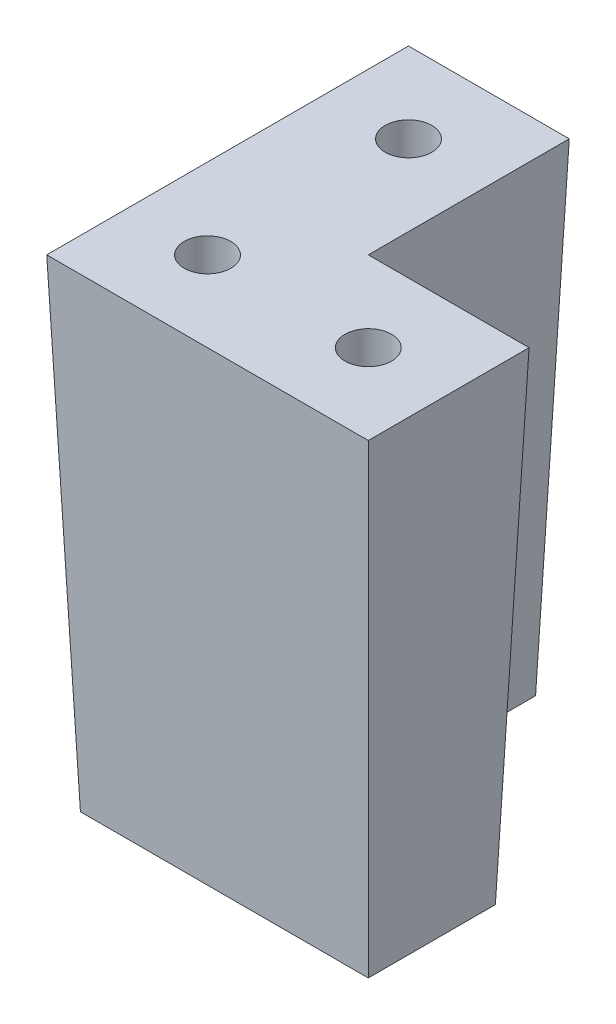
ISO-10303-21;
HEADER;
FILE_DESCRIPTION(('STEP AP214'),'2;1');
FILE_NAME('part.step','',(''),(''),'','','');
FILE_SCHEMA(('AUTOMOTIVE_DESIGN { 1 0 10303 214 1 1 1 1 }'));
ENDSEC;
DATA;
#1=APPLICATION_CONTEXT('core data for automotive mechanical design processes');
#2=APPLICATION_PROTOCOL_DEFINITION('international standard','automotive_design',2000,#1);
#3=PRODUCT_CONTEXT('',#1,'mechanical');
#4=PRODUCT('Part','Part','',(#3));
#5=PRODUCT_RELATED_PRODUCT_CATEGORY('part','',(#4));
#6=PRODUCT_DEFINITION_FORMATION('','',#4);
#7=PRODUCT_DEFINITION_CONTEXT('part definition',#1,'design');
#8=PRODUCT_DEFINITION('design','',#6,#7);
#9=PRODUCT_DEFINITION_SHAPE('','',#8);
#10=(LENGTH_UNIT() NAMED_UNIT(*) SI_UNIT(.MILLI.,.METRE.));
#11=(NAMED_UNIT(*) PLANE_ANGLE_UNIT() SI_UNIT($,.RADIAN.));
#12=(NAMED_UNIT(*) SI_UNIT($,.STERADIAN.) SOLID_ANGLE_UNIT());
#13=UNCERTAINTY_MEASURE_WITH_UNIT(LENGTH_MEASURE(1.E-05),#10,'distance_accuracy_value','');
#14=(GEOMETRIC_REPRESENTATION_CONTEXT(3) GLOBAL_UNCERTAINTY_ASSIGNED_CONTEXT((#13)) GLOBAL_UNIT_ASSIGNED_CONTEXT((#10,
#11,#12)) REPRESENTATION_CONTEXT('',''));
#15=CARTESIAN_POINT('',(0.,0.,0.));
#16=DIRECTION('',(0.,0.,1.));
#17=DIRECTION('',(1.,0.,0.));
#18=AXIS2_PLACEMENT_3D('',#15,#16,#17);
#19=CARTESIAN_POINT('',(0.,0.,0.));
#20=DIRECTION('',(-0.999390827019096,-0.034899496702501,0.));
#21=DIRECTION('',(0.034899496702501,-0.999390827019096,0.));
#22=AXIS2_PLACEMENT_3D('',#19,#20,#21);
#23=PLANE('',#22);
#24=DIRECTION('',(0.,0.,1.));
#25=VECTOR('',#24,1.);
#26=CARTESIAN_POINT('',(0.,0.,0.));
#27=LINE('',#26,#25);
#28=CARTESIAN_POINT('',(0.,0.,-45.));
#29=VERTEX_POINT('',#28);
#30=CARTESIAN_POINT('',(0.,0.,0.));
#31=VERTEX_POINT('',#30);
#32=EDGE_CURVE('E121',#29,#31,#27,.T.);
#33=ORIENTED_EDGE('',*,*,#32,.F.);
#34=DIRECTION('',(-0.0348782627423747,0.998782765958718,-0.0348782627423747));
#35=VECTOR('',#34,1.);
#36=CARTESIAN_POINT('',(0.,0.,-45.));
#37=LINE('',#36,#35);
#38=CARTESIAN_POINT('',(2.09524616950487,-60.,-42.9047538304951));
#39=VERTEX_POINT('',#38);
#40=EDGE_CURVE('E11',#39,#29,#37,.T.);
#41=ORIENTED_EDGE('',*,*,#40,.F.);
#42=DIRECTION('',(0.,0.,1.));
#43=VECTOR('',#42,1.);
#44=CARTESIAN_POINT('',(2.09524616950487,-60.,0.));
#45=LINE('',#44,#43);
#46=CARTESIAN_POINT('',(2.09524616950487,-60.,-2.09524616950487));
#47=VERTEX_POINT('',#46);
#48=EDGE_CURVE('E123',#39,#47,#45,.T.);
#49=ORIENTED_EDGE('',*,*,#48,.T.);
#50=DIRECTION('',(-0.0348782627423747,0.998782765958718,0.0348782627423747));
#51=VECTOR('',#50,1.);
#52=CARTESIAN_POINT('',(0.,0.,0.));
#53=LINE('',#52,#51);
#54=EDGE_CURVE('E94',#47,#31,#53,.T.);
#55=ORIENTED_EDGE('',*,*,#54,.T.);
#56=EDGE_LOOP('',(#33,#41,#49,#55));
#57=FACE_BOUND('',#56,.T.);
#58=ADVANCED_FACE('F43',(#57),#23,.T.);
#59=CARTESIAN_POINT('',(0.,0.,-45.));
#60=DIRECTION('',(0.,-0.034899496702501,-0.999390827019096));
#61=DIRECTION('',(0.,0.999390827019096,-0.034899496702501));
#62=AXIS2_PLACEMENT_3D('',#59,#60,#61);
#63=PLANE('',#62);
#64=DIRECTION('',(-1.,0.,0.));
#65=VECTOR('',#64,1.);
#66=CARTESIAN_POINT('',(0.,0.,-45.));
#67=LINE('',#66,#65);
#68=CARTESIAN_POINT('',(20.,0.,-45.));
#69=VERTEX_POINT('',#68);
#70=EDGE_CURVE('E136',#69,#29,#67,.T.);
#71=ORIENTED_EDGE('',*,*,#70,.F.);
#72=DIRECTION('',(0.0348782627423747,0.998782765958718,-0.0348782627423747));
#73=VECTOR('',#72,1.);
#74=CARTESIAN_POINT('',(20.,0.,-45.));
#75=LINE('',#74,#73);
#76=CARTESIAN_POINT('',(17.9047538304951,-60.,-42.9047538304951));
#77=VERTEX_POINT('',#76);
#78=EDGE_CURVE('E54',#77,#69,#75,.T.);
#79=ORIENTED_EDGE('',*,*,#78,.F.);
#80=DIRECTION('',(-1.,0.,0.));
#81=VECTOR('',#80,1.);
#82=CARTESIAN_POINT('',(0.,-60.,-42.9047538304951));
#83=LINE('',#82,#81);
#84=EDGE_CURVE('E125',#77,#39,#83,.T.);
#85=ORIENTED_EDGE('',*,*,#84,.T.);
#86=ORIENTED_EDGE('',*,*,#40,.T.);
#87=EDGE_LOOP('',(#71,#79,#85,#86));
#88=FACE_BOUND('',#87,.T.);
#89=ADVANCED_FACE('F45',(#88),#63,.T.);
#90=CARTESIAN_POINT('',(20.,0.,-45.));
#91=DIRECTION('',(0.999390827019096,-0.034899496702501,0.));
#92=DIRECTION('',(0.034899496702501,0.999390827019096,0.));
#93=AXIS2_PLACEMENT_3D('',#90,#91,#92);
#94=PLANE('',#93);
#95=DIRECTION('',(0.,0.,-1.));
#96=VECTOR('',#95,1.);
#97=CARTESIAN_POINT('',(20.,0.,-45.));
#98=LINE('',#97,#96);
#99=CARTESIAN_POINT('',(20.,0.,-20.));
#100=VERTEX_POINT('',#99);
#101=EDGE_CURVE('E152',#100,#69,#98,.T.);
#102=ORIENTED_EDGE('',*,*,#101,.F.);
#103=DIRECTION('',(0.0348782627423747,0.998782765958718,-0.0348782627423747));
#104=VECTOR('',#103,1.);
#105=CARTESIAN_POINT('',(20.0304123302982,0.870895193341597,-20.0304123302982));
#106=LINE('',#105,#104);
#107=CARTESIAN_POINT('',(17.9047538304951,-60.,-17.9047538304951));
#108=VERTEX_POINT('',#107);
#109=EDGE_CURVE('E162',#108,#100,#106,.T.);
#110=ORIENTED_EDGE('',*,*,#109,.F.);
#111=DIRECTION('',(0.,0.,-1.));
#112=VECTOR('',#111,1.);
#113=CARTESIAN_POINT('',(17.9047538304951,-60.,-45.));
#114=LINE('',#113,#112);
#115=EDGE_CURVE('E171',#108,#77,#114,.T.);
#116=ORIENTED_EDGE('',*,*,#115,.T.);
#117=ORIENTED_EDGE('',*,*,#78,.T.);
#118=EDGE_LOOP('',(#102,#110,#116,#117));
#119=FACE_BOUND('',#118,.T.);
#120=ADVANCED_FACE('F189',(#119),#94,.T.);
#121=CARTESIAN_POINT('',(40.,0.,-20.));
#122=DIRECTION('',(0.,-0.034899496702501,-0.999390827019096));
#123=DIRECTION('',(0.,0.999390827019096,-0.034899496702501));
#124=AXIS2_PLACEMENT_3D('',#121,#122,#123);
#125=PLANE('',#124);
#126=DIRECTION('',(-1.,0.,0.));
#127=VECTOR('',#126,1.);
#128=CARTESIAN_POINT('',(40.,0.,-20.));
#129=LINE('',#128,#127);
#130=CARTESIAN_POINT('',(40.,0.,-20.));
#131=VERTEX_POINT('',#130);
#132=EDGE_CURVE('E148',#131,#100,#129,.T.);
#133=ORIENTED_EDGE('',*,*,#132,.F.);
#134=DIRECTION('',(0.0348782627423747,0.998782765958718,-0.0348782627423747));
#135=VECTOR('',#134,1.);
#136=CARTESIAN_POINT('',(39.9756701357615,-0.696716154673277,-19.9756701357615));
#137=LINE('',#136,#135);
#138=CARTESIAN_POINT('',(37.9047538304951,-60.,-17.9047538304951));
#139=VERTEX_POINT('',#138);
#140=EDGE_CURVE('E159',#139,#131,#137,.T.);
#141=ORIENTED_EDGE('',*,*,#140,.F.);
#142=DIRECTION('',(-1.,0.,0.));
#143=VECTOR('',#142,1.);
#144=CARTESIAN_POINT('',(40.,-60.,-17.9047538304951));
#145=LINE('',#144,#143);
#146=EDGE_CURVE('E174',#139,#108,#145,.T.);
#147=ORIENTED_EDGE('',*,*,#146,.T.);
#148=ORIENTED_EDGE('',*,*,#109,.T.);
#149=EDGE_LOOP('',(#133,#141,#147,#148));
#150=FACE_BOUND('',#149,.T.);
#151=ADVANCED_FACE('F187',(#150),#125,.T.);
#152=CARTESIAN_POINT('',(40.,0.,0.));
#153=DIRECTION('',(0.999390827019096,-0.034899496702501,0.));
#154=DIRECTION('',(0.034899496702501,0.999390827019096,0.));
#155=AXIS2_PLACEMENT_3D('',#152,#153,#154);
#156=PLANE('',#155);
#157=DIRECTION('',(0.,0.,-1.));
#158=VECTOR('',#157,1.);
#159=CARTESIAN_POINT('',(40.,0.,0.));
#160=LINE('',#159,#158);
#161=CARTESIAN_POINT('',(40.,0.,0.));
#162=VERTEX_POINT('',#161);
#163=EDGE_CURVE('E133',#162,#131,#160,.T.);
#164=ORIENTED_EDGE('',*,*,#163,.F.);
#165=DIRECTION('',(0.0348782627423747,0.998782765958718,0.0348782627423747));
#166=VECTOR('',#165,1.);
#167=CARTESIAN_POINT('',(39.951340271523,-1.39343230934656,-0.0486597284770448));
#168=LINE('',#167,#166);
#169=CARTESIAN_POINT('',(37.9047538304951,-60.,-2.09524616950487));
#170=VERTEX_POINT('',#169);
#171=EDGE_CURVE('E87',#170,#162,#168,.T.);
#172=ORIENTED_EDGE('',*,*,#171,.F.);
#173=DIRECTION('',(0.,0.,-1.));
#174=VECTOR('',#173,1.);
#175=CARTESIAN_POINT('',(37.9047538304951,-60.,0.));
#176=LINE('',#175,#174);
#177=EDGE_CURVE('E177',#170,#139,#176,.T.);
#178=ORIENTED_EDGE('',*,*,#177,.T.);
#179=ORIENTED_EDGE('',*,*,#140,.T.);
#180=EDGE_LOOP('',(#164,#172,#178,#179));
#181=FACE_BOUND('',#180,.T.);
#182=ADVANCED_FACE('F188',(#181),#156,.T.);
#183=CARTESIAN_POINT('',(0.,0.,0.));
#184=DIRECTION('',(0.,-0.034899496702501,0.999390827019096));
#185=DIRECTION('',(0.,-0.999390827019096,-0.034899496702501));
#186=AXIS2_PLACEMENT_3D('',#183,#184,#185);
#187=PLANE('',#186);
#188=DIRECTION('',(1.,0.,0.));
#189=VECTOR('',#188,1.);
#190=CARTESIAN_POINT('',(0.,0.,0.));
#191=LINE('',#190,#189);
#192=EDGE_CURVE('E128',#31,#162,#191,.T.);
#193=ORIENTED_EDGE('',*,*,#192,.F.);
#194=ORIENTED_EDGE('',*,*,#54,.F.);
#195=DIRECTION('',(1.,0.,0.));
#196=VECTOR('',#195,1.);
#197=CARTESIAN_POINT('',(0.,-60.,-2.09524616950487));
#198=LINE('',#197,#196);
#199=EDGE_CURVE('E47',#47,#170,#198,.T.);
#200=ORIENTED_EDGE('',*,*,#199,.T.);
#201=ORIENTED_EDGE('',*,*,#171,.T.);
#202=EDGE_LOOP('',(#193,#194,#200,#201));
#203=FACE_BOUND('',#202,.T.);
#204=ADVANCED_FACE('F129',(#203),#187,.T.);
#205=CARTESIAN_POINT('',(0.,-60.,0.));
#206=DIRECTION('',(0.,-1.,0.));
#207=DIRECTION('',(0.,0.,-1.));
#208=AXIS2_PLACEMENT_3D('',#205,#206,#207);
#209=PLANE('',#208);
#210=CARTESIAN_POINT('',(9.99999999999091,-60.,-10.));
#211=DIRECTION('',(0.,-1.,0.));
#212=DIRECTION('',(0.,0.,-1.));
#213=AXIS2_PLACEMENT_3D('',#210,#211,#212);
#214=CIRCLE('',#213,5.74999999999999);
#215=CARTESIAN_POINT('',(9.99999999999091,-60.,-15.75));
#216=VERTEX_POINT('',#215);
#217=EDGE_CURVE('E359',#216,#216,#214,.T.);
#218=ORIENTED_EDGE('',*,*,#217,.F.);
#219=EDGE_LOOP('',(#218));
#220=FACE_BOUND('',#219,.T.);
#221=CARTESIAN_POINT('',(30.,-60.,-9.99999999996308));
#222=DIRECTION('',(0.,-1.,0.));
#223=DIRECTION('',(0.,0.,-1.));
#224=AXIS2_PLACEMENT_3D('',#221,#222,#223);
#225=CIRCLE('',#224,5.74999999999999);
#226=CARTESIAN_POINT('',(30.,-60.,-15.7499999999631));
#227=VERTEX_POINT('',#226);
#228=EDGE_CURVE('E373',#227,#227,#225,.T.);
#229=ORIENTED_EDGE('',*,*,#228,.F.);
#230=EDGE_LOOP('',(#229));
#231=FACE_BOUND('',#230,.T.);
#232=CARTESIAN_POINT('',(10.,-60.,-34.9999999999966));
#233=DIRECTION('',(0.,-1.,0.));
#234=DIRECTION('',(0.,0.,-1.));
#235=AXIS2_PLACEMENT_3D('',#232,#233,#234);
#236=CIRCLE('',#235,5.74999999999999);
#237=CARTESIAN_POINT('',(10.,-60.,-40.7499999999966));
#238=VERTEX_POINT('',#237);
#239=EDGE_CURVE('E389',#238,#238,#236,.T.);
#240=ORIENTED_EDGE('',*,*,#239,.F.);
#241=EDGE_LOOP('',(#240));
#242=FACE_BOUND('',#241,.T.);
#243=ORIENTED_EDGE('',*,*,#48,.F.);
#244=ORIENTED_EDGE('',*,*,#84,.F.);
#245=ORIENTED_EDGE('',*,*,#115,.F.);
#246=ORIENTED_EDGE('',*,*,#146,.F.);
#247=ORIENTED_EDGE('',*,*,#177,.F.);
#248=ORIENTED_EDGE('',*,*,#199,.F.);
#249=EDGE_LOOP('',(#243,#244,#245,#246,#247,#248));
#250=FACE_BOUND('',#249,.T.);
#251=ADVANCED_FACE('F181',(#220,#231,#242,#250),#209,.T.);
#252=CARTESIAN_POINT('',(0.,0.,0.));
#253=DIRECTION('',(0.,-1.,0.));
#254=DIRECTION('',(0.,0.,-1.));
#255=AXIS2_PLACEMENT_3D('',#252,#253,#254);
#256=PLANE('',#255);
#257=CARTESIAN_POINT('',(9.99999999999091,0.,-10.));
#258=DIRECTION('',(0.,-1.,0.));
#259=DIRECTION('',(0.,0.,-1.));
#260=AXIS2_PLACEMENT_3D('',#257,#258,#259);
#261=CIRCLE('',#260,2.89999999999999);
#262=CARTESIAN_POINT('',(9.99999999999091,0.,-12.9));
#263=VERTEX_POINT('',#262);
#264=EDGE_CURVE('E369',#263,#263,#261,.T.);
#265=ORIENTED_EDGE('',*,*,#264,.T.);
#266=EDGE_LOOP('',(#265));
#267=FACE_BOUND('',#266,.T.);
#268=CARTESIAN_POINT('',(30.,0.,-9.99999999996308));
#269=DIRECTION('',(0.,-1.,0.));
#270=DIRECTION('',(0.,0.,-1.));
#271=AXIS2_PLACEMENT_3D('',#268,#269,#270);
#272=CIRCLE('',#271,2.89999999999999);
#273=CARTESIAN_POINT('',(30.,0.,-12.8999999999631));
#274=VERTEX_POINT('',#273);
#275=EDGE_CURVE('E385',#274,#274,#272,.T.);
#276=ORIENTED_EDGE('',*,*,#275,.T.);
#277=EDGE_LOOP('',(#276));
#278=FACE_BOUND('',#277,.T.);
#279=CARTESIAN_POINT('',(10.,0.,-34.9999999999966));
#280=DIRECTION('',(0.,-1.,0.));
#281=DIRECTION('',(0.,0.,-1.));
#282=AXIS2_PLACEMENT_3D('',#279,#280,#281);
#283=CIRCLE('',#282,2.89999999999998);
#284=CARTESIAN_POINT('',(10.,0.,-37.8999999999966));
#285=VERTEX_POINT('',#284);
#286=EDGE_CURVE('E138',#285,#285,#283,.T.);
#287=ORIENTED_EDGE('',*,*,#286,.T.);
#288=EDGE_LOOP('',(#287));
#289=FACE_BOUND('',#288,.T.);
#290=ORIENTED_EDGE('',*,*,#32,.T.);
#291=ORIENTED_EDGE('',*,*,#192,.T.);
#292=ORIENTED_EDGE('',*,*,#163,.T.);
#293=ORIENTED_EDGE('',*,*,#132,.T.);
#294=ORIENTED_EDGE('',*,*,#101,.T.);
#295=ORIENTED_EDGE('',*,*,#70,.T.);
#296=EDGE_LOOP('',(#290,#291,#292,#293,#294,#295));
#297=FACE_BOUND('',#296,.T.);
#298=ADVANCED_FACE('F135',(#267,#278,#289,#297),#256,.F.);
#299=CARTESIAN_POINT('',(10.,-60.,-34.9999999999966));
#300=DIRECTION('',(0.,-1.,0.));
#301=DIRECTION('',(0.,0.,-1.));
#302=AXIS2_PLACEMENT_3D('',#299,#300,#301);
#303=CYLINDRICAL_SURFACE('',#302,2.89999999999999);
#304=ORIENTED_EDGE('',*,*,#286,.F.);
#305=EDGE_LOOP('',(#304));
#306=FACE_BOUND('',#305,.T.);
#307=CARTESIAN_POINT('',(10.,-5.,-34.9999999999966));
#308=DIRECTION('',(0.,-1.,0.));
#309=DIRECTION('',(0.,0.,-1.));
#310=AXIS2_PLACEMENT_3D('',#307,#308,#309);
#311=CIRCLE('',#310,2.89999999999999);
#312=CARTESIAN_POINT('',(10.,-5.,-37.8999999999966));
#313=VERTEX_POINT('',#312);
#314=EDGE_CURVE('E142',#313,#313,#311,.T.);
#315=ORIENTED_EDGE('',*,*,#314,.T.);
#316=EDGE_LOOP('',(#315));
#317=FACE_BOUND('',#316,.T.);
#318=ADVANCED_FACE('F226',(#306,#317),#303,.F.);
#319=CARTESIAN_POINT('',(12.9,-5.,-34.9999999999966));
#320=DIRECTION('',(0.,1.,0.));
#321=DIRECTION('',(0.,0.,1.));
#322=AXIS2_PLACEMENT_3D('',#319,#320,#321);
#323=PLANE('',#322);
#324=ORIENTED_EDGE('',*,*,#314,.F.);
#325=EDGE_LOOP('',(#324));
#326=FACE_BOUND('',#325,.T.);
#327=CARTESIAN_POINT('',(10.,-5.,-34.9999999999966));
#328=DIRECTION('',(0.,-1.,0.));
#329=DIRECTION('',(0.,0.,-1.));
#330=AXIS2_PLACEMENT_3D('',#327,#328,#329);
#331=CIRCLE('',#330,5.74999999999999);
#332=CARTESIAN_POINT('',(10.,-5.,-40.7499999999966));
#333=VERTEX_POINT('',#332);
#334=EDGE_CURVE('E393',#333,#333,#331,.T.);
#335=ORIENTED_EDGE('',*,*,#334,.T.);
#336=EDGE_LOOP('',(#335));
#337=FACE_BOUND('',#336,.T.);
#338=ADVANCED_FACE('F232',(#326,#337),#323,.F.);
#339=CARTESIAN_POINT('',(10.,-60.,-34.9999999999966));
#340=DIRECTION('',(0.,-1.,0.));
#341=DIRECTION('',(0.,0.,-1.));
#342=AXIS2_PLACEMENT_3D('',#339,#340,#341);
#343=CYLINDRICAL_SURFACE('',#342,5.74999999999999);
#344=ORIENTED_EDGE('',*,*,#334,.F.);
#345=EDGE_LOOP('',(#344));
#346=FACE_BOUND('',#345,.T.);
#347=ORIENTED_EDGE('',*,*,#239,.T.);
#348=EDGE_LOOP('',(#347));
#349=FACE_BOUND('',#348,.T.);
#350=ADVANCED_FACE('F240',(#346,#349),#343,.F.);
#351=CARTESIAN_POINT('',(30.,-60.,-9.99999999996308));
#352=DIRECTION('',(0.,-1.,0.));
#353=DIRECTION('',(0.,0.,-1.));
#354=AXIS2_PLACEMENT_3D('',#351,#352,#353);
#355=CYLINDRICAL_SURFACE('',#354,2.89999999999999);
#356=ORIENTED_EDGE('',*,*,#275,.F.);
#357=EDGE_LOOP('',(#356));
#358=FACE_BOUND('',#357,.T.);
#359=CARTESIAN_POINT('',(30.,-5.,-9.99999999996308));
#360=DIRECTION('',(0.,-1.,0.));
#361=DIRECTION('',(0.,0.,-1.));
#362=AXIS2_PLACEMENT_3D('',#359,#360,#361);
#363=CIRCLE('',#362,2.89999999999999);
#364=CARTESIAN_POINT('',(30.,-5.,-12.8999999999631));
#365=VERTEX_POINT('',#364);
#366=EDGE_CURVE('E381',#365,#365,#363,.T.);
#367=ORIENTED_EDGE('',*,*,#366,.T.);
#368=EDGE_LOOP('',(#367));
#369=FACE_BOUND('',#368,.T.);
#370=ADVANCED_FACE('F248',(#358,#369),#355,.F.);
#371=CARTESIAN_POINT('',(32.9,-5.,-9.99999999996308));
#372=DIRECTION('',(0.,1.,0.));
#373=DIRECTION('',(0.,0.,1.));
#374=AXIS2_PLACEMENT_3D('',#371,#372,#373);
#375=PLANE('',#374);
#376=ORIENTED_EDGE('',*,*,#366,.F.);
#377=EDGE_LOOP('',(#376));
#378=FACE_BOUND('',#377,.T.);
#379=CARTESIAN_POINT('',(30.,-5.,-9.99999999996308));
#380=DIRECTION('',(0.,-1.,0.));
#381=DIRECTION('',(0.,0.,-1.));
#382=AXIS2_PLACEMENT_3D('',#379,#380,#381);
#383=CIRCLE('',#382,5.74999999999999);
#384=CARTESIAN_POINT('',(30.,-5.,-15.7499999999631));
#385=VERTEX_POINT('',#384);
#386=EDGE_CURVE('E377',#385,#385,#383,.T.);
#387=ORIENTED_EDGE('',*,*,#386,.T.);
#388=EDGE_LOOP('',(#387));
#389=FACE_BOUND('',#388,.T.);
#390=ADVANCED_FACE('F256',(#378,#389),#375,.F.);
#391=CARTESIAN_POINT('',(30.,-60.,-9.99999999996308));
#392=DIRECTION('',(0.,-1.,0.));
#393=DIRECTION('',(0.,0.,-1.));
#394=AXIS2_PLACEMENT_3D('',#391,#392,#393);
#395=CYLINDRICAL_SURFACE('',#394,5.74999999999999);
#396=ORIENTED_EDGE('',*,*,#386,.F.);
#397=EDGE_LOOP('',(#396));
#398=FACE_BOUND('',#397,.T.);
#399=ORIENTED_EDGE('',*,*,#228,.T.);
#400=EDGE_LOOP('',(#399));
#401=FACE_BOUND('',#400,.T.);
#402=ADVANCED_FACE('F264',(#398,#401),#395,.F.);
#403=CARTESIAN_POINT('',(9.99999999999091,-60.,-10.));
#404=DIRECTION('',(0.,-1.,0.));
#405=DIRECTION('',(0.,0.,-1.));
#406=AXIS2_PLACEMENT_3D('',#403,#404,#405);
#407=CYLINDRICAL_SURFACE('',#406,2.89999999999999);
#408=ORIENTED_EDGE('',*,*,#264,.F.);
#409=EDGE_LOOP('',(#408));
#410=FACE_BOUND('',#409,.T.);
#411=CARTESIAN_POINT('',(9.99999999999091,-5.,-10.));
#412=DIRECTION('',(0.,-1.,0.));
#413=DIRECTION('',(0.,0.,-1.));
#414=AXIS2_PLACEMENT_3D('',#411,#412,#413);
#415=CIRCLE('',#414,2.89999999999999);
#416=CARTESIAN_POINT('',(9.99999999999091,-5.,-12.9));
#417=VERTEX_POINT('',#416);
#418=EDGE_CURVE('E363',#417,#417,#415,.T.);
#419=ORIENTED_EDGE('',*,*,#418,.T.);
#420=EDGE_LOOP('',(#419));
#421=FACE_BOUND('',#420,.T.);
#422=ADVANCED_FACE('F273',(#410,#421),#407,.F.);
#423=CARTESIAN_POINT('',(12.8999999999909,-5.,-10.));
#424=DIRECTION('',(0.,1.,0.));
#425=DIRECTION('',(0.,0.,1.));
#426=AXIS2_PLACEMENT_3D('',#423,#424,#425);
#427=PLANE('',#426);
#428=ORIENTED_EDGE('',*,*,#418,.F.);
#429=EDGE_LOOP('',(#428));
#430=FACE_BOUND('',#429,.T.);
#431=CARTESIAN_POINT('',(9.99999999999091,-5.,-10.));
#432=DIRECTION('',(0.,-1.,0.));
#433=DIRECTION('',(0.,0.,-1.));
#434=AXIS2_PLACEMENT_3D('',#431,#432,#433);
#435=CIRCLE('',#434,5.74999999999999);
#436=CARTESIAN_POINT('',(9.99999999999091,-5.,-15.75));
#437=VERTEX_POINT('',#436);
#438=EDGE_CURVE('E356',#437,#437,#435,.T.);
#439=ORIENTED_EDGE('',*,*,#438,.T.);
#440=EDGE_LOOP('',(#439));
#441=FACE_BOUND('',#440,.T.);
#442=ADVANCED_FACE('F279',(#430,#441),#427,.F.);
#443=CARTESIAN_POINT('',(9.99999999999091,-60.,-10.));
#444=DIRECTION('',(0.,-1.,0.));
#445=DIRECTION('',(0.,0.,-1.));
#446=AXIS2_PLACEMENT_3D('',#443,#444,#445);
#447=CYLINDRICAL_SURFACE('',#446,5.74999999999999);
#448=ORIENTED_EDGE('',*,*,#438,.F.);
#449=EDGE_LOOP('',(#448));
#450=FACE_BOUND('',#449,.T.);
#451=ORIENTED_EDGE('',*,*,#217,.T.);
#452=EDGE_LOOP('',(#451));
#453=FACE_BOUND('',#452,.T.);
#454=ADVANCED_FACE('F287',(#450,#453),#447,.F.);
#455=CLOSED_SHELL('',(#58,#89,#120,#151,#182,#204,#251,#298,#318,#338,#350,#370,#390,#402,#422,
#442,#454));
#456=MANIFOLD_SOLID_BREP('B2',#455);
#457=ADVANCED_BREP_SHAPE_REPRESENTATION('',(#18,#456),#14);
#458=SHAPE_DEFINITION_REPRESENTATION(#9,#457);
ENDSEC;
END-ISO-10303-21;
